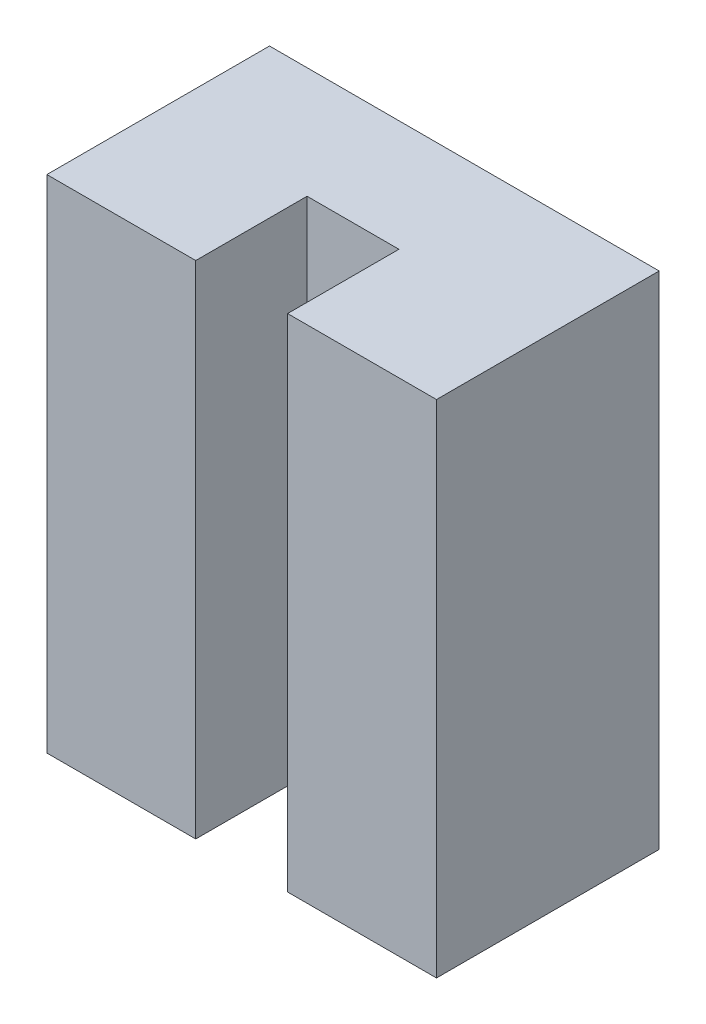
ISO-10303-21;
HEADER;
FILE_DESCRIPTION(('STEP AP214'),'2;1');
FILE_NAME('part.step','',(''),(''),'','','');
FILE_SCHEMA(('AUTOMOTIVE_DESIGN { 1 0 10303 214 1 1 1 1 }'));
ENDSEC;
DATA;
#1=APPLICATION_CONTEXT('core data for automotive mechanical design processes');
#2=APPLICATION_PROTOCOL_DEFINITION('international standard','automotive_design',2000,#1);
#3=PRODUCT_CONTEXT('',#1,'mechanical');
#4=PRODUCT('Part','Part','',(#3));
#5=PRODUCT_RELATED_PRODUCT_CATEGORY('part','',(#4));
#6=PRODUCT_DEFINITION_FORMATION('','',#4);
#7=PRODUCT_DEFINITION_CONTEXT('part definition',#1,'design');
#8=PRODUCT_DEFINITION('design','',#6,#7);
#9=PRODUCT_DEFINITION_SHAPE('','',#8);
#10=(LENGTH_UNIT() NAMED_UNIT(*) SI_UNIT(.MILLI.,.METRE.));
#11=(NAMED_UNIT(*) PLANE_ANGLE_UNIT() SI_UNIT($,.RADIAN.));
#12=(NAMED_UNIT(*) SI_UNIT($,.STERADIAN.) SOLID_ANGLE_UNIT());
#13=UNCERTAINTY_MEASURE_WITH_UNIT(LENGTH_MEASURE(1.E-05),#10,'distance_accuracy_value','');
#14=(GEOMETRIC_REPRESENTATION_CONTEXT(3) GLOBAL_UNCERTAINTY_ASSIGNED_CONTEXT((#13)) GLOBAL_UNIT_ASSIGNED_CONTEXT((#10,
#11,#12)) REPRESENTATION_CONTEXT('',''));
#15=CARTESIAN_POINT('',(0.,0.,0.));
#16=DIRECTION('',(0.,0.,1.));
#17=DIRECTION('',(1.,0.,0.));
#18=AXIS2_PLACEMENT_3D('',#15,#16,#17);
#19=CARTESIAN_POINT('',(-146.65,73.,-165.));
#20=DIRECTION('',(1.,0.,0.));
#21=DIRECTION('',(0.,1.,0.));
#22=AXIS2_PLACEMENT_3D('',#19,#20,#21);
#23=PLANE('',#22);
#24=DIRECTION('',(0.,0.,-1.));
#25=VECTOR('',#24,1.);
#26=CARTESIAN_POINT('',(-146.65,74.,-167.));
#27=LINE('',#26,#25);
#28=CARTESIAN_POINT('',(-146.65,74.,-161.));
#29=VERTEX_POINT('',#28);
#30=CARTESIAN_POINT('',(-146.65,74.,-165.));
#31=VERTEX_POINT('',#30);
#32=EDGE_CURVE('E85',#29,#31,#27,.T.);
#33=ORIENTED_EDGE('',*,*,#32,.T.);
#34=DIRECTION('',(0.,1.,0.));
#35=VECTOR('',#34,1.);
#36=CARTESIAN_POINT('',(-146.65,73.,-165.));
#37=LINE('',#36,#35);
#38=CARTESIAN_POINT('',(-146.65,92.,-165.));
#39=VERTEX_POINT('',#38);
#40=EDGE_CURVE('E11',#31,#39,#37,.T.);
#41=ORIENTED_EDGE('',*,*,#40,.T.);
#42=DIRECTION('',(0.,0.,-1.));
#43=VECTOR('',#42,1.);
#44=CARTESIAN_POINT('',(-146.65,92.,-167.));
#45=LINE('',#44,#43);
#46=CARTESIAN_POINT('',(-146.65,92.,-161.));
#47=VERTEX_POINT('',#46);
#48=EDGE_CURVE('E82',#47,#39,#45,.T.);
#49=ORIENTED_EDGE('',*,*,#48,.F.);
#50=DIRECTION('',(0.,1.,0.));
#51=VECTOR('',#50,1.);
#52=CARTESIAN_POINT('',(-146.65,73.5,-161.));
#53=LINE('',#52,#51);
#54=EDGE_CURVE('E260',#29,#47,#53,.T.);
#55=ORIENTED_EDGE('',*,*,#54,.F.);
#56=EDGE_LOOP('',(#33,#41,#49,#55));
#57=FACE_BOUND('',#56,.T.);
#58=ADVANCED_FACE('F17',(#57),#23,.T.);
#59=CARTESIAN_POINT('',(-146.65,73.,-165.));
#60=DIRECTION('',(0.,0.,1.));
#61=DIRECTION('',(1.,0.,0.));
#62=AXIS2_PLACEMENT_3D('',#59,#60,#61);
#63=PLANE('',#62);
#64=ORIENTED_EDGE('',*,*,#40,.F.);
#65=DIRECTION('',(1.,0.,0.));
#66=VECTOR('',#65,1.);
#67=CARTESIAN_POINT('',(-149.325,74.,-165.));
#68=LINE('',#67,#66);
#69=CARTESIAN_POINT('',(-143.35,74.,-165.));
#70=VERTEX_POINT('',#69);
#71=EDGE_CURVE('E238',#31,#70,#68,.T.);
#72=ORIENTED_EDGE('',*,*,#71,.T.);
#73=DIRECTION('',(0.,1.,0.));
#74=VECTOR('',#73,1.);
#75=CARTESIAN_POINT('',(-143.35,73.,-165.));
#76=LINE('',#75,#74);
#77=CARTESIAN_POINT('',(-143.35,92.,-165.));
#78=VERTEX_POINT('',#77);
#79=EDGE_CURVE('E21',#70,#78,#76,.T.);
#80=ORIENTED_EDGE('',*,*,#79,.T.);
#81=DIRECTION('',(1.,0.,0.));
#82=VECTOR('',#81,1.);
#83=CARTESIAN_POINT('',(-149.325,92.,-165.));
#84=LINE('',#83,#82);
#85=EDGE_CURVE('E90',#39,#78,#84,.T.);
#86=ORIENTED_EDGE('',*,*,#85,.F.);
#87=EDGE_LOOP('',(#64,#72,#80,#86));
#88=FACE_BOUND('',#87,.T.);
#89=ADVANCED_FACE('F19',(#88),#63,.T.);
#90=CARTESIAN_POINT('',(-143.35,73.,-165.));
#91=DIRECTION('',(1.,0.,0.));
#92=DIRECTION('',(0.,1.,0.));
#93=AXIS2_PLACEMENT_3D('',#90,#91,#92);
#94=PLANE('',#93);
#95=DIRECTION('',(0.,1.,0.));
#96=VECTOR('',#95,1.);
#97=CARTESIAN_POINT('',(-143.35,73.5,-161.));
#98=LINE('',#97,#96);
#99=CARTESIAN_POINT('',(-143.35,74.,-161.));
#100=VERTEX_POINT('',#99);
#101=CARTESIAN_POINT('',(-143.35,92.,-161.));
#102=VERTEX_POINT('',#101);
#103=EDGE_CURVE('E40',#100,#102,#98,.T.);
#104=ORIENTED_EDGE('',*,*,#103,.T.);
#105=DIRECTION('',(0.,0.,-1.));
#106=VECTOR('',#105,1.);
#107=CARTESIAN_POINT('',(-143.35,92.,-167.));
#108=LINE('',#107,#106);
#109=EDGE_CURVE('E94',#102,#78,#108,.T.);
#110=ORIENTED_EDGE('',*,*,#109,.T.);
#111=ORIENTED_EDGE('',*,*,#79,.F.);
#112=DIRECTION('',(0.,0.,-1.));
#113=VECTOR('',#112,1.);
#114=CARTESIAN_POINT('',(-143.35,74.,-167.));
#115=LINE('',#114,#113);
#116=EDGE_CURVE('E236',#100,#70,#115,.T.);
#117=ORIENTED_EDGE('',*,*,#116,.F.);
#118=EDGE_LOOP('',(#104,#110,#111,#117));
#119=FACE_BOUND('',#118,.T.);
#120=ADVANCED_FACE('F194',(#119),#94,.F.);
#121=CARTESIAN_POINT('',(-152.,74.,-161.));
#122=DIRECTION('',(0.,0.,1.));
#123=DIRECTION('',(1.,0.,0.));
#124=AXIS2_PLACEMENT_3D('',#121,#122,#123);
#125=PLANE('',#124);
#126=DIRECTION('',(1.,0.,0.));
#127=VECTOR('',#126,1.);
#128=CARTESIAN_POINT('',(-152.,92.,-161.));
#129=LINE('',#128,#127);
#130=CARTESIAN_POINT('',(-138.,92.,-161.));
#131=VERTEX_POINT('',#130);
#132=EDGE_CURVE('E114',#102,#131,#129,.T.);
#133=ORIENTED_EDGE('',*,*,#132,.F.);
#134=ORIENTED_EDGE('',*,*,#103,.F.);
#135=DIRECTION('',(1.,0.,0.));
#136=VECTOR('',#135,1.);
#137=CARTESIAN_POINT('',(-152.,74.,-161.));
#138=LINE('',#137,#136);
#139=CARTESIAN_POINT('',(-138.,74.,-161.));
#140=VERTEX_POINT('',#139);
#141=EDGE_CURVE('E234',#100,#140,#138,.T.);
#142=ORIENTED_EDGE('',*,*,#141,.T.);
#143=DIRECTION('',(0.,1.,0.));
#144=VECTOR('',#143,1.);
#145=CARTESIAN_POINT('',(-138.,74.,-161.));
#146=LINE('',#145,#144);
#147=EDGE_CURVE('E119',#140,#131,#146,.T.);
#148=ORIENTED_EDGE('',*,*,#147,.T.);
#149=EDGE_LOOP('',(#133,#134,#142,#148));
#150=FACE_BOUND('',#149,.T.);
#151=ADVANCED_FACE('F185',(#150),#125,.T.);
#152=CARTESIAN_POINT('',(-138.,74.,-169.));
#153=DIRECTION('',(1.,0.,0.));
#154=DIRECTION('',(0.,1.,0.));
#155=AXIS2_PLACEMENT_3D('',#152,#153,#154);
#156=PLANE('',#155);
#157=DIRECTION('',(0.,0.,1.));
#158=VECTOR('',#157,1.);
#159=CARTESIAN_POINT('',(-138.,74.,-169.));
#160=LINE('',#159,#158);
#161=CARTESIAN_POINT('',(-138.,74.,-169.));
#162=VERTEX_POINT('',#161);
#163=EDGE_CURVE('E243',#162,#140,#160,.T.);
#164=ORIENTED_EDGE('',*,*,#163,.F.);
#165=DIRECTION('',(0.,1.,0.));
#166=VECTOR('',#165,1.);
#167=CARTESIAN_POINT('',(-138.,74.,-169.));
#168=LINE('',#167,#166);
#169=CARTESIAN_POINT('',(-138.,92.,-169.));
#170=VERTEX_POINT('',#169);
#171=EDGE_CURVE('E118',#162,#170,#168,.T.);
#172=ORIENTED_EDGE('',*,*,#171,.T.);
#173=DIRECTION('',(0.,0.,1.));
#174=VECTOR('',#173,1.);
#175=CARTESIAN_POINT('',(-138.,92.,-169.));
#176=LINE('',#175,#174);
#177=EDGE_CURVE('E108',#170,#131,#176,.T.);
#178=ORIENTED_EDGE('',*,*,#177,.T.);
#179=ORIENTED_EDGE('',*,*,#147,.F.);
#180=EDGE_LOOP('',(#164,#172,#178,#179));
#181=FACE_BOUND('',#180,.T.);
#182=ADVANCED_FACE('F176',(#181),#156,.T.);
#183=CARTESIAN_POINT('',(-152.,74.,-169.));
#184=DIRECTION('',(0.,0.,1.));
#185=DIRECTION('',(1.,0.,0.));
#186=AXIS2_PLACEMENT_3D('',#183,#184,#185);
#187=PLANE('',#186);
#188=DIRECTION('',(1.,0.,0.));
#189=VECTOR('',#188,1.);
#190=CARTESIAN_POINT('',(-152.,92.,-169.));
#191=LINE('',#190,#189);
#192=CARTESIAN_POINT('',(-152.,92.,-169.));
#193=VERTEX_POINT('',#192);
#194=EDGE_CURVE('E103',#193,#170,#191,.T.);
#195=ORIENTED_EDGE('',*,*,#194,.T.);
#196=ORIENTED_EDGE('',*,*,#171,.F.);
#197=DIRECTION('',(1.,0.,0.));
#198=VECTOR('',#197,1.);
#199=CARTESIAN_POINT('',(-152.,74.,-169.));
#200=LINE('',#199,#198);
#201=CARTESIAN_POINT('',(-152.,74.,-169.));
#202=VERTEX_POINT('',#201);
#203=EDGE_CURVE('E255',#202,#162,#200,.T.);
#204=ORIENTED_EDGE('',*,*,#203,.F.);
#205=DIRECTION('',(0.,1.,0.));
#206=VECTOR('',#205,1.);
#207=CARTESIAN_POINT('',(-152.,74.,-169.));
#208=LINE('',#207,#206);
#209=EDGE_CURVE('E251',#202,#193,#208,.T.);
#210=ORIENTED_EDGE('',*,*,#209,.T.);
#211=EDGE_LOOP('',(#195,#196,#204,#210));
#212=FACE_BOUND('',#211,.T.);
#213=ADVANCED_FACE('F168',(#212),#187,.F.);
#214=CARTESIAN_POINT('',(-152.,92.,-169.));
#215=DIRECTION('',(0.,1.,0.));
#216=DIRECTION('',(1.,0.,0.));
#217=AXIS2_PLACEMENT_3D('',#214,#215,#216);
#218=PLANE('',#217);
#219=ORIENTED_EDGE('',*,*,#177,.F.);
#220=ORIENTED_EDGE('',*,*,#194,.F.);
#221=DIRECTION('',(0.,0.,1.));
#222=VECTOR('',#221,1.);
#223=CARTESIAN_POINT('',(-152.,92.,-169.));
#224=LINE('',#223,#222);
#225=CARTESIAN_POINT('',(-152.,92.,-161.));
#226=VERTEX_POINT('',#225);
#227=EDGE_CURVE('E277',#193,#226,#224,.T.);
#228=ORIENTED_EDGE('',*,*,#227,.T.);
#229=DIRECTION('',(1.,0.,0.));
#230=VECTOR('',#229,1.);
#231=CARTESIAN_POINT('',(-152.,92.,-161.));
#232=LINE('',#231,#230);
#233=EDGE_CURVE('E101',#226,#47,#232,.T.);
#234=ORIENTED_EDGE('',*,*,#233,.T.);
#235=ORIENTED_EDGE('',*,*,#48,.T.);
#236=ORIENTED_EDGE('',*,*,#85,.T.);
#237=ORIENTED_EDGE('',*,*,#109,.F.);
#238=ORIENTED_EDGE('',*,*,#132,.T.);
#239=EDGE_LOOP('',(#219,#220,#228,#234,#235,#236,#237,#238));
#240=FACE_BOUND('',#239,.T.);
#241=ADVANCED_FACE('F98',(#240),#218,.T.);
#242=CARTESIAN_POINT('',(-152.,74.,-161.));
#243=DIRECTION('',(0.,0.,1.));
#244=DIRECTION('',(1.,0.,0.));
#245=AXIS2_PLACEMENT_3D('',#242,#243,#244);
#246=PLANE('',#245);
#247=ORIENTED_EDGE('',*,*,#233,.F.);
#248=DIRECTION('',(0.,1.,0.));
#249=VECTOR('',#248,1.);
#250=CARTESIAN_POINT('',(-152.,74.,-161.));
#251=LINE('',#250,#249);
#252=CARTESIAN_POINT('',(-152.,74.,-161.));
#253=VERTEX_POINT('',#252);
#254=EDGE_CURVE('E287',#253,#226,#251,.T.);
#255=ORIENTED_EDGE('',*,*,#254,.F.);
#256=DIRECTION('',(1.,0.,0.));
#257=VECTOR('',#256,1.);
#258=CARTESIAN_POINT('',(-152.,74.,-161.));
#259=LINE('',#258,#257);
#260=EDGE_CURVE('E256',#253,#29,#259,.T.);
#261=ORIENTED_EDGE('',*,*,#260,.T.);
#262=ORIENTED_EDGE('',*,*,#54,.T.);
#263=EDGE_LOOP('',(#247,#255,#261,#262));
#264=FACE_BOUND('',#263,.T.);
#265=ADVANCED_FACE('F151',(#264),#246,.T.);
#266=CARTESIAN_POINT('',(-152.,74.,-169.));
#267=DIRECTION('',(0.,1.,0.));
#268=DIRECTION('',(1.,0.,0.));
#269=AXIS2_PLACEMENT_3D('',#266,#267,#268);
#270=PLANE('',#269);
#271=ORIENTED_EDGE('',*,*,#141,.F.);
#272=ORIENTED_EDGE('',*,*,#116,.T.);
#273=ORIENTED_EDGE('',*,*,#71,.F.);
#274=ORIENTED_EDGE('',*,*,#32,.F.);
#275=ORIENTED_EDGE('',*,*,#260,.F.);
#276=DIRECTION('',(0.,0.,1.));
#277=VECTOR('',#276,1.);
#278=CARTESIAN_POINT('',(-152.,74.,-169.));
#279=LINE('',#278,#277);
#280=EDGE_CURVE('E245',#202,#253,#279,.T.);
#281=ORIENTED_EDGE('',*,*,#280,.F.);
#282=ORIENTED_EDGE('',*,*,#203,.T.);
#283=ORIENTED_EDGE('',*,*,#163,.T.);
#284=EDGE_LOOP('',(#271,#272,#273,#274,#275,#281,#282,#283));
#285=FACE_BOUND('',#284,.T.);
#286=ADVANCED_FACE('F142',(#285),#270,.F.);
#287=CARTESIAN_POINT('',(-152.,74.,-169.));
#288=DIRECTION('',(1.,0.,0.));
#289=DIRECTION('',(0.,1.,0.));
#290=AXIS2_PLACEMENT_3D('',#287,#288,#289);
#291=PLANE('',#290);
#292=ORIENTED_EDGE('',*,*,#254,.T.);
#293=ORIENTED_EDGE('',*,*,#227,.F.);
#294=ORIENTED_EDGE('',*,*,#209,.F.);
#295=ORIENTED_EDGE('',*,*,#280,.T.);
#296=EDGE_LOOP('',(#292,#293,#294,#295));
#297=FACE_BOUND('',#296,.T.);
#298=ADVANCED_FACE('F137',(#297),#291,.F.);
#299=CLOSED_SHELL('',(#58,#89,#120,#151,#182,#213,#241,#265,#286,#298));
#300=MANIFOLD_SOLID_BREP('B1',#299);
#301=ADVANCED_BREP_SHAPE_REPRESENTATION('',(#18,#300),#14);
#302=SHAPE_DEFINITION_REPRESENTATION(#9,#301);
ENDSEC;
END-ISO-10303-21;
